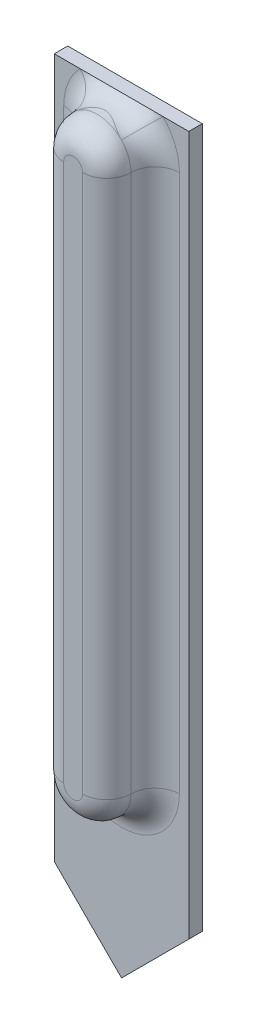
ISO-10303-21;
HEADER;
FILE_DESCRIPTION(('STEP AP214'),'2;1');
FILE_NAME('part.step','',(''),(''),'','','');
FILE_SCHEMA(('AUTOMOTIVE_DESIGN { 1 0 10303 214 1 1 1 1 }'));
ENDSEC;
DATA;
#1=APPLICATION_CONTEXT('core data for automotive mechanical design processes');
#2=APPLICATION_PROTOCOL_DEFINITION('international standard','automotive_design',2000,#1);
#3=PRODUCT_CONTEXT('',#1,'mechanical');
#4=PRODUCT('Part','Part','',(#3));
#5=PRODUCT_RELATED_PRODUCT_CATEGORY('part','',(#4));
#6=PRODUCT_DEFINITION_FORMATION('','',#4);
#7=PRODUCT_DEFINITION_CONTEXT('part definition',#1,'design');
#8=PRODUCT_DEFINITION('design','',#6,#7);
#9=PRODUCT_DEFINITION_SHAPE('','',#8);
#10=(LENGTH_UNIT() NAMED_UNIT(*) SI_UNIT(.MILLI.,.METRE.));
#11=(NAMED_UNIT(*) PLANE_ANGLE_UNIT() SI_UNIT($,.RADIAN.));
#12=(NAMED_UNIT(*) SI_UNIT($,.STERADIAN.) SOLID_ANGLE_UNIT());
#13=UNCERTAINTY_MEASURE_WITH_UNIT(LENGTH_MEASURE(1.E-05),#10,'distance_accuracy_value','');
#14=(GEOMETRIC_REPRESENTATION_CONTEXT(3) GLOBAL_UNCERTAINTY_ASSIGNED_CONTEXT((#13)) GLOBAL_UNIT_ASSIGNED_CONTEXT((#10,
#11,#12)) REPRESENTATION_CONTEXT('',''));
#15=CARTESIAN_POINT('',(0.,0.,0.));
#16=DIRECTION('',(0.,0.,1.));
#17=DIRECTION('',(1.,0.,0.));
#18=AXIS2_PLACEMENT_3D('',#15,#16,#17);
#19=CARTESIAN_POINT('',(-0.43,0.,0.28));
#20=DIRECTION('',(0.,-1.,0.));
#21=DIRECTION('',(1.,0.,0.));
#22=AXIS2_PLACEMENT_3D('',#19,#20,#21);
#23=CYLINDRICAL_SURFACE('',#22,0.28);
#24=CARTESIAN_POINT('',(-0.43,5.4,0.28));
#25=DIRECTION('',(0.,1.,0.));
#26=DIRECTION('',(1.,0.,0.));
#27=AXIS2_PLACEMENT_3D('',#24,#25,#26);
#28=CIRCLE('',#27,0.28);
#29=CARTESIAN_POINT('',(-0.15,5.4,0.28));
#30=VERTEX_POINT('',#29);
#31=CARTESIAN_POINT('',(-0.43,5.4,0.));
#32=VERTEX_POINT('',#31);
#33=EDGE_CURVE('E379',#30,#32,#28,.T.);
#34=ORIENTED_EDGE('',*,*,#33,.F.);
#35=DIRECTION('',(0.,1.,0.));
#36=VECTOR('',#35,1.);
#37=CARTESIAN_POINT('',(-0.15,0.,0.28));
#38=LINE('',#37,#36);
#39=CARTESIAN_POINT('',(-0.15,1.4,0.28));
#40=VERTEX_POINT('',#39);
#41=EDGE_CURVE('E35',#40,#30,#38,.T.);
#42=ORIENTED_EDGE('',*,*,#41,.F.);
#43=CARTESIAN_POINT('',(-0.43,1.4,0.28));
#44=DIRECTION('',(0.,-1.,0.));
#45=DIRECTION('',(1.,0.,0.));
#46=AXIS2_PLACEMENT_3D('',#43,#44,#45);
#47=CIRCLE('',#46,0.28);
#48=CARTESIAN_POINT('',(-0.43,1.4,0.));
#49=VERTEX_POINT('',#48);
#50=EDGE_CURVE('E11',#49,#40,#47,.T.);
#51=ORIENTED_EDGE('',*,*,#50,.F.);
#52=DIRECTION('',(0.,1.,0.));
#53=VECTOR('',#52,1.);
#54=CARTESIAN_POINT('',(-0.43,0.,0.));
#55=LINE('',#54,#53);
#56=EDGE_CURVE('E258',#49,#32,#55,.T.);
#57=ORIENTED_EDGE('',*,*,#56,.T.);
#58=EDGE_LOOP('',(#34,#42,#51,#57));
#59=FACE_BOUND('',#58,.T.);
#60=ADVANCED_FACE('F17',(#59),#23,.T.);
#61=CARTESIAN_POINT('',(0.,1.4,0.28));
#62=DIRECTION('',(0.,0.,1.));
#63=DIRECTION('',(1.,0.,0.));
#64=AXIS2_PLACEMENT_3D('',#61,#62,#63);
#65=TOROIDAL_SURFACE('',#64,0.43,0.28);
#66=CARTESIAN_POINT('',(0.43,1.4,0.28));
#67=DIRECTION('',(0.,1.,0.));
#68=DIRECTION('',(0.,0.,-1.));
#69=AXIS2_PLACEMENT_3D('',#66,#67,#68);
#70=CIRCLE('',#69,0.28);
#71=CARTESIAN_POINT('',(0.43,1.4,0.));
#72=VERTEX_POINT('',#71);
#73=CARTESIAN_POINT('',(0.15,1.4,0.28));
#74=VERTEX_POINT('',#73);
#75=EDGE_CURVE('E199',#72,#74,#70,.T.);
#76=ORIENTED_EDGE('',*,*,#75,.F.);
#77=CARTESIAN_POINT('',(0.,1.4,0.));
#78=DIRECTION('',(0.,0.,-1.));
#79=DIRECTION('',(1.,0.,0.));
#80=AXIS2_PLACEMENT_3D('',#77,#78,#79);
#81=CIRCLE('',#80,0.43);
#82=EDGE_CURVE('E261',#72,#49,#81,.T.);
#83=ORIENTED_EDGE('',*,*,#82,.T.);
#84=ORIENTED_EDGE('',*,*,#50,.T.);
#85=CARTESIAN_POINT('',(0.,1.4,0.28));
#86=DIRECTION('',(0.,0.,-1.));
#87=DIRECTION('',(1.,0.,0.));
#88=AXIS2_PLACEMENT_3D('',#85,#86,#87);
#89=CIRCLE('',#88,0.15);
#90=EDGE_CURVE('E210',#74,#40,#89,.T.);
#91=ORIENTED_EDGE('',*,*,#90,.F.);
#92=EDGE_LOOP('',(#76,#83,#84,#91));
#93=FACE_BOUND('',#92,.T.);
#94=ADVANCED_FACE('F212',(#93),#65,.T.);
#95=CARTESIAN_POINT('',(-0.07,5.4,0.28));
#96=DIRECTION('',(0.,1.,0.));
#97=DIRECTION('',(-1.,0.,0.));
#98=AXIS2_PLACEMENT_3D('',#95,#96,#97);
#99=CYLINDRICAL_SURFACE('',#98,0.08);
#100=DIRECTION('',(0.,-1.,0.));
#101=VECTOR('',#100,1.);
#102=CARTESIAN_POINT('',(-0.07,5.4,0.36));
#103=LINE('',#102,#101);
#104=CARTESIAN_POINT('',(-0.07,5.4,0.36));
#105=VERTEX_POINT('',#104);
#106=CARTESIAN_POINT('',(-0.07,1.4,0.36));
#107=VERTEX_POINT('',#106);
#108=EDGE_CURVE('E299',#105,#107,#103,.T.);
#109=ORIENTED_EDGE('',*,*,#108,.T.);
#110=CARTESIAN_POINT('',(-0.07,1.4,0.28));
#111=DIRECTION('',(0.,1.,0.));
#112=DIRECTION('',(-1.,0.,0.));
#113=AXIS2_PLACEMENT_3D('',#110,#111,#112);
#114=CIRCLE('',#113,0.08);
#115=EDGE_CURVE('E207',#40,#107,#114,.T.);
#116=ORIENTED_EDGE('',*,*,#115,.F.);
#117=ORIENTED_EDGE('',*,*,#41,.T.);
#118=CARTESIAN_POINT('',(-0.07,5.4,0.28));
#119=DIRECTION('',(0.,-1.,0.));
#120=DIRECTION('',(-1.,0.,0.));
#121=AXIS2_PLACEMENT_3D('',#118,#119,#120);
#122=CIRCLE('',#121,0.08);
#123=EDGE_CURVE('E215',#105,#30,#122,.T.);
#124=ORIENTED_EDGE('',*,*,#123,.F.);
#125=EDGE_LOOP('',(#109,#116,#117,#124));
#126=FACE_BOUND('',#125,.T.);
#127=ADVANCED_FACE('F937',(#126),#99,.F.);
#128=CARTESIAN_POINT('',(0.43,0.,0.28));
#129=DIRECTION('',(0.,1.,0.));
#130=DIRECTION('',(-1.,0.,0.));
#131=AXIS2_PLACEMENT_3D('',#128,#129,#130);
#132=CYLINDRICAL_SURFACE('',#131,0.28);
#133=CARTESIAN_POINT('',(0.43,5.4,0.28));
#134=DIRECTION('',(0.,1.,0.));
#135=DIRECTION('',(-1.,0.,0.));
#136=AXIS2_PLACEMENT_3D('',#133,#134,#135);
#137=CIRCLE('',#136,0.28);
#138=CARTESIAN_POINT('',(0.43,5.4,0.));
#139=VERTEX_POINT('',#138);
#140=CARTESIAN_POINT('',(0.15,5.4,0.28));
#141=VERTEX_POINT('',#140);
#142=EDGE_CURVE('E372',#139,#141,#137,.T.);
#143=ORIENTED_EDGE('',*,*,#142,.F.);
#144=DIRECTION('',(0.,-1.,0.));
#145=VECTOR('',#144,1.);
#146=CARTESIAN_POINT('',(0.43,0.,0.));
#147=LINE('',#146,#145);
#148=EDGE_CURVE('E204',#139,#72,#147,.T.);
#149=ORIENTED_EDGE('',*,*,#148,.T.);
#150=ORIENTED_EDGE('',*,*,#75,.T.);
#151=DIRECTION('',(0.,-1.,0.));
#152=VECTOR('',#151,1.);
#153=CARTESIAN_POINT('',(0.15,0.,0.28));
#154=LINE('',#153,#152);
#155=EDGE_CURVE('E202',#141,#74,#154,.T.);
#156=ORIENTED_EDGE('',*,*,#155,.F.);
#157=EDGE_LOOP('',(#143,#149,#150,#156));
#158=FACE_BOUND('',#157,.T.);
#159=ADVANCED_FACE('F200',(#158),#132,.T.);
#160=CARTESIAN_POINT('',(0.15,1.4,0.28));
#161=CARTESIAN_POINT('',(0.15,1.4,0.300943951024));
#162=CARTESIAN_POINT('',(0.143421785118,1.4,0.321886120056));
#163=CARTESIAN_POINT('',(0.130255211971,1.4,0.340255211971));
#164=CARTESIAN_POINT('',(0.111886120056,1.4,0.353421785118));
#165=CARTESIAN_POINT('',(0.09094395102393,1.4,0.36));
#166=CARTESIAN_POINT('',(0.07,1.4,0.36));
#167=(BOUNDED_CURVE() B_SPLINE_CURVE(6,(#160,#161,#162,#163,#164,#165,#166),.UNSPECIFIED.,.F.,
.F.) B_SPLINE_CURVE_WITH_KNOTS((7,7),(0.,1.570796326795),
.UNSPECIFIED.) CURVE() GEOMETRIC_REPRESENTATION_ITEM() RATIONAL_B_SPLINE_CURVE((1.,1.,1.,1.,1.,
1.,1.)) REPRESENTATION_ITEM(''));
#168=CARTESIAN_POINT('',(0.,1.4,0.28));
#169=DIRECTION('',(0.,0.,-1.));
#170=AXIS1_PLACEMENT('',#168,#169);
#171=SURFACE_OF_REVOLUTION('',#167,#170);
#172=CARTESIAN_POINT('',(0.07,1.4,0.28));
#173=DIRECTION('',(0.,-1.,0.));
#174=DIRECTION('',(0.,0.,-1.));
#175=AXIS2_PLACEMENT_3D('',#172,#173,#174);
#176=CIRCLE('',#175,0.08);
#177=CARTESIAN_POINT('',(0.07,1.4,0.36));
#178=VERTEX_POINT('',#177);
#179=EDGE_CURVE('E218',#74,#178,#176,.T.);
#180=ORIENTED_EDGE('',*,*,#179,.F.);
#181=ORIENTED_EDGE('',*,*,#90,.T.);
#182=ORIENTED_EDGE('',*,*,#115,.T.);
#183=CARTESIAN_POINT('',(0.,1.4,0.36));
#184=DIRECTION('',(0.,0.,1.));
#185=DIRECTION('',(1.,0.,0.));
#186=AXIS2_PLACEMENT_3D('',#183,#184,#185);
#187=CIRCLE('',#186,0.07);
#188=EDGE_CURVE('E221',#107,#178,#187,.T.);
#189=ORIENTED_EDGE('',*,*,#188,.T.);
#190=EDGE_LOOP('',(#180,#181,#182,#189));
#191=FACE_BOUND('',#190,.T.);
#192=ADVANCED_FACE('F219',(#191),#171,.T.);
#193=CARTESIAN_POINT('',(0.15,5.4,0.28));
#194=CARTESIAN_POINT('',(0.15,5.4,0.300943951024));
#195=CARTESIAN_POINT('',(0.143421785118,5.4,0.321886120056));
#196=CARTESIAN_POINT('',(0.130255211971,5.4,0.340255211971));
#197=CARTESIAN_POINT('',(0.111886120056,5.4,0.353421785118));
#198=CARTESIAN_POINT('',(0.09094395102393,5.4,0.36));
#199=CARTESIAN_POINT('',(0.07,5.4,0.36));
#200=(BOUNDED_CURVE() B_SPLINE_CURVE(6,(#193,#194,#195,#196,#197,#198,#199),.UNSPECIFIED.,.F.,
.F.) B_SPLINE_CURVE_WITH_KNOTS((7,7),(0.,1.570796326795),
.UNSPECIFIED.) CURVE() GEOMETRIC_REPRESENTATION_ITEM() RATIONAL_B_SPLINE_CURVE((1.,1.,1.,1.,1.,
1.,1.)) REPRESENTATION_ITEM(''));
#201=CARTESIAN_POINT('',(0.,5.4,0.28));
#202=DIRECTION('',(0.,0.,-1.));
#203=AXIS1_PLACEMENT('',#201,#202);
#204=SURFACE_OF_REVOLUTION('',#200,#203);
#205=CARTESIAN_POINT('',(0.07,5.4,0.28));
#206=DIRECTION('',(0.,1.,0.));
#207=DIRECTION('',(0.,0.,-1.));
#208=AXIS2_PLACEMENT_3D('',#205,#206,#207);
#209=CIRCLE('',#208,0.08);
#210=CARTESIAN_POINT('',(0.07,5.4,0.36));
#211=VERTEX_POINT('',#210);
#212=EDGE_CURVE('E226',#211,#141,#209,.T.);
#213=ORIENTED_EDGE('',*,*,#212,.F.);
#214=CARTESIAN_POINT('',(0.,5.4,0.36));
#215=DIRECTION('',(0.,0.,1.));
#216=DIRECTION('',(1.,0.,0.));
#217=AXIS2_PLACEMENT_3D('',#214,#215,#216);
#218=CIRCLE('',#217,0.07);
#219=EDGE_CURVE('E303',#211,#105,#218,.T.);
#220=ORIENTED_EDGE('',*,*,#219,.T.);
#221=ORIENTED_EDGE('',*,*,#123,.T.);
#222=CARTESIAN_POINT('',(0.,5.4,0.28));
#223=DIRECTION('',(0.,0.,-1.));
#224=DIRECTION('',(1.,0.,0.));
#225=AXIS2_PLACEMENT_3D('',#222,#223,#224);
#226=CIRCLE('',#225,0.15);
#227=EDGE_CURVE('E376',#30,#141,#226,.T.);
#228=ORIENTED_EDGE('',*,*,#227,.T.);
#229=EDGE_LOOP('',(#213,#220,#221,#228));
#230=FACE_BOUND('',#229,.T.);
#231=ADVANCED_FACE('F404',(#230),#204,.T.);
#232=CARTESIAN_POINT('',(0.,5.4,0.28));
#233=DIRECTION('',(0.,0.,1.));
#234=DIRECTION('',(1.,0.,0.));
#235=AXIS2_PLACEMENT_3D('',#232,#233,#234);
#236=TOROIDAL_SURFACE('',#235,0.43,0.28);
#237=ORIENTED_EDGE('',*,*,#142,.T.);
#238=ORIENTED_EDGE('',*,*,#227,.F.);
#239=ORIENTED_EDGE('',*,*,#33,.T.);
#240=CARTESIAN_POINT('',(0.,5.4,0.));
#241=DIRECTION('',(0.,0.,-1.));
#242=DIRECTION('',(1.,0.,0.));
#243=AXIS2_PLACEMENT_3D('',#240,#241,#242);
#244=CIRCLE('',#243,0.43);
#245=CARTESIAN_POINT('',(-0.380657326213184,5.6,-2.85944483641018E-13));
#246=VERTEX_POINT('',#245);
#247=EDGE_CURVE('E262',#32,#246,#244,.T.);
#248=ORIENTED_EDGE('',*,*,#247,.T.);
#249=CARTESIAN_POINT('',(0.380657326213,5.6,0.));
#250=CARTESIAN_POINT('',(0.369265778447278,5.6,-1.33592421031915E-06));
#251=CARTESIAN_POINT('',(0.357884462033694,5.6,0.000545017819219254));
#252=CARTESIAN_POINT('',(0.335235360128118,5.6,0.00265065401306003));
#253=CARTESIAN_POINT('',(0.323967407943893,5.6,0.00420812242431116));
#254=CARTESIAN_POINT('',(0.290870595400767,5.6,0.0101940780378531));
#255=CARTESIAN_POINT('',(0.269276279320048,5.6,0.0159435030557364));
#256=CARTESIAN_POINT('',(0.226436441400275,5.6,0.0303853868389739));
#257=CARTESIAN_POINT('',(0.205220137236004,5.6,0.0391598792523773));
#258=CARTESIAN_POINT('',(0.163476360737768,5.6,0.0585149386945481));
#259=CARTESIAN_POINT('',(0.142955231678801,5.6,0.0691085304697929));
#260=CARTESIAN_POINT('',(0.109404370335143,5.6,0.0861820813977293));
#261=CARTESIAN_POINT('',(0.0964063955692927,5.6,0.0927366145753031));
#262=CARTESIAN_POINT('',(0.0699170110930512,5.6,0.104712716842719));
#263=CARTESIAN_POINT('',(0.0564288225283927,5.6,0.110140508200042));
#264=CARTESIAN_POINT('',(0.0338856294843694,5.6,0.116492705298667));
#265=CARTESIAN_POINT('',(0.0251152147782352,5.6,0.118345938032509));
#266=CARTESIAN_POINT('',(0.00739313410097159,5.6,0.120388493139228));
#267=CARTESIAN_POINT('',(-0.00155784046259295,5.6,0.120583270817005));
#268=CARTESIAN_POINT('',(-0.0192952675839967,5.6,0.119261377805226));
#269=CARTESIAN_POINT('',(-0.0280820925903135,5.6,0.117749231205838));
#270=CARTESIAN_POINT('',(-0.0453551978293148,5.6,0.113456170266929));
#271=CARTESIAN_POINT('',(-0.0538399562089449,5.6,0.110669605317146));
#272=CARTESIAN_POINT('',(-0.0717306776236306,5.6,0.103880614644502));
#273=CARTESIAN_POINT('',(-0.0810894289585774,5.6,0.0997598543903345));
#274=CARTESIAN_POINT('',(-0.0996007450859248,5.6,0.0910655495473647));
#275=CARTESIAN_POINT('',(-0.108752997062347,5.6,0.0864913681161041));
#276=CARTESIAN_POINT('',(-0.132817275338334,5.6,0.0742957039799425));
#277=CARTESIAN_POINT('',(-0.147685455573006,5.6,0.0665887377592019));
#278=CARTESIAN_POINT('',(-0.177726505314637,5.6,0.0517985874107665));
#279=CARTESIAN_POINT('',(-0.19289915207552,5.6,0.0447149663116638));
#280=CARTESIAN_POINT('',(-0.223642460063189,5.6,0.0317624590156617));
#281=CARTESIAN_POINT('',(-0.239209609326278,5.6,0.0258854489598574));
#282=CARTESIAN_POINT('',(-0.270849566509956,5.6,0.0157133359664126));
#283=CARTESIAN_POINT('',(-0.286921869000176,5.6,0.0114167032459062));
#284=CARTESIAN_POINT('',(-0.315858089459119,5.6,0.00548463031003479));
#285=CARTESIAN_POINT('',(-0.328643593557601,5.6,0.00347043632575685));
#286=CARTESIAN_POINT('',(-0.354499175550265,5.6,0.000718361207376242));
#287=CARTESIAN_POINT('',(-0.36757083423336,5.6,-4.4603957010552E-06));
#288=CARTESIAN_POINT('',(-0.380657326212883,5.6,-5.71888967282037E-13));
#289=B_SPLINE_CURVE_WITH_KNOTS('',3,(#249,#250,#251,#252,#253,#254,#255,#256,#257,#258,#259,
#260,#261,#262,#263,#264,#265,#266,#267,#268,#269,#270,#271,#272,#273,#274,#275,#276,#277,#278,
#279,#280,#281,#282,#283,#284,#285,#286,#287,#288),.UNSPECIFIED.,.F.,.F.,(4,2,2,2,2,2,2,2,2,2,2,
2,2,2,2,2,2,2,2,4),(0.,0.034145005419316,0.0682289200042966,0.134997870390923,0.203742085432163,
0.27300076352762,0.316685757040761,0.360122681843135,0.386894366118891,0.413577953734025,
0.440190983979014,0.466923174453457,0.497572761076844,0.52826602284001,0.578506324787384,
0.628711122433613,0.678565934817153,0.728372360648604,0.767139947509182,0.806356748207118),.UNSPECIFIED.);
#290=CARTESIAN_POINT('',(0.380657326213243,5.6,0.));
#291=VERTEX_POINT('',#290);
#292=EDGE_CURVE('E22',#291,#246,#289,.T.);
#293=ORIENTED_EDGE('',*,*,#292,.F.);
#294=CARTESIAN_POINT('',(0.,5.4,0.));
#295=DIRECTION('',(0.,0.,-1.));
#296=DIRECTION('',(1.,0.,0.));
#297=AXIS2_PLACEMENT_3D('',#294,#295,#296);
#298=CIRCLE('',#297,0.43);
#299=EDGE_CURVE('E430',#291,#139,#298,.T.);
#300=ORIENTED_EDGE('',*,*,#299,.T.);
#301=EDGE_LOOP('',(#237,#238,#239,#248,#293,#300));
#302=FACE_BOUND('',#301,.T.);
#303=ADVANCED_FACE('F407',(#302),#236,.T.);
#304=CARTESIAN_POINT('',(0.07,5.4,0.28));
#305=DIRECTION('',(0.,-1.,0.));
#306=DIRECTION('',(1.,0.,0.));
#307=AXIS2_PLACEMENT_3D('',#304,#305,#306);
#308=CYLINDRICAL_SURFACE('',#307,0.08);
#309=ORIENTED_EDGE('',*,*,#155,.T.);
#310=ORIENTED_EDGE('',*,*,#179,.T.);
#311=DIRECTION('',(0.,1.,0.));
#312=VECTOR('',#311,1.);
#313=CARTESIAN_POINT('',(0.07,5.4,0.36));
#314=LINE('',#313,#312);
#315=EDGE_CURVE('E236',#178,#211,#314,.T.);
#316=ORIENTED_EDGE('',*,*,#315,.T.);
#317=ORIENTED_EDGE('',*,*,#212,.T.);
#318=EDGE_LOOP('',(#309,#310,#316,#317));
#319=FACE_BOUND('',#318,.T.);
#320=ADVANCED_FACE('F229',(#319),#308,.F.);
#321=CARTESIAN_POINT('',(0.,5.4,0.36));
#322=DIRECTION('',(0.,0.,1.));
#323=DIRECTION('',(1.,0.,0.));
#324=AXIS2_PLACEMENT_3D('',#321,#322,#323);
#325=PLANE('',#324);
#326=ORIENTED_EDGE('',*,*,#108,.F.);
#327=ORIENTED_EDGE('',*,*,#219,.F.);
#328=ORIENTED_EDGE('',*,*,#315,.F.);
#329=ORIENTED_EDGE('',*,*,#188,.F.);
#330=EDGE_LOOP('',(#326,#327,#328,#329));
#331=FACE_BOUND('',#330,.T.);
#332=ADVANCED_FACE('F898',(#331),#325,.F.);
#333=CARTESIAN_POINT('',(0.,5.6,0.1));
#334=DIRECTION('',(0.,-1.,0.));
#335=DIRECTION('',(0.,0.,-1.));
#336=AXIS2_PLACEMENT_3D('',#333,#334,#335);
#337=PLANE('',#336);
#338=ORIENTED_EDGE('',*,*,#292,.T.);
#339=DIRECTION('',(-1.,0.,0.));
#340=VECTOR('',#339,1.);
#341=CARTESIAN_POINT('',(0.,5.6,0.));
#342=LINE('',#341,#340);
#343=EDGE_CURVE('E423',#291,#246,#342,.T.);
#344=ORIENTED_EDGE('',*,*,#343,.F.);
#345=EDGE_LOOP('',(#338,#344));
#346=FACE_BOUND('',#345,.T.);
#347=ADVANCED_FACE('F890',(#346),#337,.T.);
#348=CARTESIAN_POINT('',(-0.43,0.,0.28));
#349=DIRECTION('',(0.,-1.,0.));
#350=DIRECTION('',(1.,0.,0.));
#351=AXIS2_PLACEMENT_3D('',#348,#349,#350);
#352=CYLINDRICAL_SURFACE('',#351,0.18);
#353=CARTESIAN_POINT('',(-0.43,5.4,0.28));
#354=DIRECTION('',(0.,1.,0.));
#355=DIRECTION('',(0.,0.,1.));
#356=AXIS2_PLACEMENT_3D('',#353,#354,#355);
#357=CIRCLE('',#356,0.18);
#358=CARTESIAN_POINT('',(-0.25,5.4,0.28));
#359=VERTEX_POINT('',#358);
#360=CARTESIAN_POINT('',(-0.43,5.4,0.1));
#361=VERTEX_POINT('',#360);
#362=EDGE_CURVE('E364',#359,#361,#357,.T.);
#363=ORIENTED_EDGE('',*,*,#362,.T.);
#364=DIRECTION('',(0.,1.,0.));
#365=VECTOR('',#364,1.);
#366=CARTESIAN_POINT('',(-0.43,0.,0.1));
#367=LINE('',#366,#365);
#368=CARTESIAN_POINT('',(-0.43,1.4,0.1));
#369=VERTEX_POINT('',#368);
#370=EDGE_CURVE('E311',#369,#361,#367,.T.);
#371=ORIENTED_EDGE('',*,*,#370,.F.);
#372=CARTESIAN_POINT('',(-0.43,1.4,0.28));
#373=DIRECTION('',(0.,-1.,0.));
#374=DIRECTION('',(0.,0.,-1.));
#375=AXIS2_PLACEMENT_3D('',#372,#373,#374);
#376=CIRCLE('',#375,0.18);
#377=CARTESIAN_POINT('',(-0.25,1.4,0.28));
#378=VERTEX_POINT('',#377);
#379=EDGE_CURVE('E248',#369,#378,#376,.T.);
#380=ORIENTED_EDGE('',*,*,#379,.T.);
#381=DIRECTION('',(0.,1.,0.));
#382=VECTOR('',#381,1.);
#383=CARTESIAN_POINT('',(-0.25,5.4,0.28));
#384=LINE('',#383,#382);
#385=EDGE_CURVE('E251',#378,#359,#384,.T.);
#386=ORIENTED_EDGE('',*,*,#385,.T.);
#387=EDGE_LOOP('',(#363,#371,#380,#386));
#388=FACE_BOUND('',#387,.T.);
#389=ADVANCED_FACE('F592',(#388),#352,.F.);
#390=CARTESIAN_POINT('',(0.,1.4,0.28));
#391=DIRECTION('',(0.,0.,1.));
#392=DIRECTION('',(1.,0.,0.));
#393=AXIS2_PLACEMENT_3D('',#390,#391,#392);
#394=TOROIDAL_SURFACE('',#393,0.43,0.18);
#395=CARTESIAN_POINT('',(0.43,1.4,0.28));
#396=DIRECTION('',(0.,1.,0.));
#397=DIRECTION('',(0.,0.,1.));
#398=AXIS2_PLACEMENT_3D('',#395,#396,#397);
#399=CIRCLE('',#398,0.18);
#400=CARTESIAN_POINT('',(0.43,1.4,0.1));
#401=VERTEX_POINT('',#400);
#402=CARTESIAN_POINT('',(0.25,1.4,0.28));
#403=VERTEX_POINT('',#402);
#404=EDGE_CURVE('E360',#401,#403,#399,.T.);
#405=ORIENTED_EDGE('',*,*,#404,.T.);
#406=CARTESIAN_POINT('',(0.,1.4,0.28));
#407=DIRECTION('',(0.,0.,-1.));
#408=DIRECTION('',(1.,0.,0.));
#409=AXIS2_PLACEMENT_3D('',#406,#407,#408);
#410=CIRCLE('',#409,0.25);
#411=EDGE_CURVE('E272',#403,#378,#410,.T.);
#412=ORIENTED_EDGE('',*,*,#411,.T.);
#413=ORIENTED_EDGE('',*,*,#379,.F.);
#414=CARTESIAN_POINT('',(0.,1.4,0.1));
#415=DIRECTION('',(0.,0.,-1.));
#416=DIRECTION('',(1.,0.,0.));
#417=AXIS2_PLACEMENT_3D('',#414,#415,#416);
#418=CIRCLE('',#417,0.43);
#419=EDGE_CURVE('E321',#401,#369,#418,.T.);
#420=ORIENTED_EDGE('',*,*,#419,.F.);
#421=EDGE_LOOP('',(#405,#412,#413,#420));
#422=FACE_BOUND('',#421,.T.);
#423=ADVANCED_FACE('F866',(#422),#394,.F.);
#424=CARTESIAN_POINT('',(-0.07,5.4,0.28));
#425=DIRECTION('',(0.,1.,0.));
#426=DIRECTION('',(-1.,0.,0.));
#427=AXIS2_PLACEMENT_3D('',#424,#425,#426);
#428=CYLINDRICAL_SURFACE('',#427,0.18);
#429=DIRECTION('',(0.,-1.,0.));
#430=VECTOR('',#429,1.);
#431=CARTESIAN_POINT('',(-0.07,1.4,0.46));
#432=LINE('',#431,#430);
#433=CARTESIAN_POINT('',(-0.07,5.4,0.46));
#434=VERTEX_POINT('',#433);
#435=CARTESIAN_POINT('',(-0.07,1.4,0.46));
#436=VERTEX_POINT('',#435);
#437=EDGE_CURVE('E326',#434,#436,#432,.T.);
#438=ORIENTED_EDGE('',*,*,#437,.F.);
#439=CARTESIAN_POINT('',(-0.07,5.4,0.28));
#440=DIRECTION('',(0.,-1.,0.));
#441=DIRECTION('',(0.,0.,-1.));
#442=AXIS2_PLACEMENT_3D('',#439,#440,#441);
#443=CIRCLE('',#442,0.18);
#444=EDGE_CURVE('E273',#434,#359,#443,.T.);
#445=ORIENTED_EDGE('',*,*,#444,.T.);
#446=ORIENTED_EDGE('',*,*,#385,.F.);
#447=CARTESIAN_POINT('',(-0.07,1.4,0.28));
#448=DIRECTION('',(0.,1.,0.));
#449=DIRECTION('',(0.,0.,1.));
#450=AXIS2_PLACEMENT_3D('',#447,#448,#449);
#451=CIRCLE('',#450,0.18);
#452=EDGE_CURVE('E269',#378,#436,#451,.T.);
#453=ORIENTED_EDGE('',*,*,#452,.T.);
#454=EDGE_LOOP('',(#438,#445,#446,#453));
#455=FACE_BOUND('',#454,.T.);
#456=ADVANCED_FACE('F595',(#455),#428,.T.);
#457=CARTESIAN_POINT('',(0.,5.4,0.28));
#458=DIRECTION('',(0.,0.,1.));
#459=DIRECTION('',(1.,0.,0.));
#460=AXIS2_PLACEMENT_3D('',#457,#458,#459);
#461=TOROIDAL_SURFACE('',#460,0.43,0.18);
#462=CARTESIAN_POINT('',(-0.308058436015,5.7,0.28));
#463=DIRECTION('',(0.697674418604688,0.716414967476679,0.));
#464=DIRECTION('',(-0.716414967476679,0.697674418604688,0.));
#465=AXIS2_PLACEMENT_3D('',#462,#463,#464);
#466=CIRCLE('',#465,0.18);
#467=CARTESIAN_POINT('',(-0.179103741869,5.574418604651,0.28));
#468=VERTEX_POINT('',#467);
#469=CARTESIAN_POINT('',(-0.308058436015,5.7,0.1));
#470=VERTEX_POINT('',#469);
#471=EDGE_CURVE('E495',#468,#470,#466,.T.);
#472=ORIENTED_EDGE('',*,*,#471,.T.);
#473=CARTESIAN_POINT('',(0.,5.4,0.1));
#474=DIRECTION('',(0.,0.,-1.));
#475=DIRECTION('',(1.,0.,0.));
#476=AXIS2_PLACEMENT_3D('',#473,#474,#475);
#477=CIRCLE('',#476,0.43);
#478=EDGE_CURVE('E279',#361,#470,#477,.T.);
#479=ORIENTED_EDGE('',*,*,#478,.F.);
#480=ORIENTED_EDGE('',*,*,#362,.F.);
#481=CARTESIAN_POINT('',(0.,5.4,0.28));
#482=DIRECTION('',(0.,0.,-1.));
#483=DIRECTION('',(1.,0.,0.));
#484=AXIS2_PLACEMENT_3D('',#481,#482,#483);
#485=CIRCLE('',#484,0.25);
#486=EDGE_CURVE('E356',#359,#468,#485,.T.);
#487=ORIENTED_EDGE('',*,*,#486,.T.);
#488=EDGE_LOOP('',(#472,#479,#480,#487));
#489=FACE_BOUND('',#488,.T.);
#490=ADVANCED_FACE('F477',(#489),#461,.F.);
#491=CARTESIAN_POINT('',(0.43,0.,0.28));
#492=DIRECTION('',(0.,1.,0.));
#493=DIRECTION('',(-1.,0.,0.));
#494=AXIS2_PLACEMENT_3D('',#491,#492,#493);
#495=CYLINDRICAL_SURFACE('',#494,0.18);
#496=CARTESIAN_POINT('',(0.43,5.4,0.28));
#497=DIRECTION('',(0.,1.,0.));
#498=DIRECTION('',(0.,0.,1.));
#499=AXIS2_PLACEMENT_3D('',#496,#497,#498);
#500=CIRCLE('',#499,0.18);
#501=CARTESIAN_POINT('',(0.43,5.4,0.1));
#502=VERTEX_POINT('',#501);
#503=CARTESIAN_POINT('',(0.25,5.4,0.28));
#504=VERTEX_POINT('',#503);
#505=EDGE_CURVE('E242',#502,#504,#500,.T.);
#506=ORIENTED_EDGE('',*,*,#505,.T.);
#507=DIRECTION('',(0.,-1.,0.));
#508=VECTOR('',#507,1.);
#509=CARTESIAN_POINT('',(0.25,1.4,0.28));
#510=LINE('',#509,#508);
#511=EDGE_CURVE('E340',#504,#403,#510,.T.);
#512=ORIENTED_EDGE('',*,*,#511,.T.);
#513=ORIENTED_EDGE('',*,*,#404,.F.);
#514=DIRECTION('',(0.,-1.,0.));
#515=VECTOR('',#514,1.);
#516=CARTESIAN_POINT('',(0.43,0.,0.1));
#517=LINE('',#516,#515);
#518=EDGE_CURVE('E278',#502,#401,#517,.T.);
#519=ORIENTED_EDGE('',*,*,#518,.F.);
#520=EDGE_LOOP('',(#506,#512,#513,#519));
#521=FACE_BOUND('',#520,.T.);
#522=ADVANCED_FACE('F411',(#521),#495,.F.);
#523=CARTESIAN_POINT('',(0.25,1.4,0.28));
#524=CARTESIAN_POINT('',(0.25,1.4,0.327123889804));
#525=CARTESIAN_POINT('',(0.235199016516,1.4,0.374243770127));
#526=CARTESIAN_POINT('',(0.205574226935,1.4,0.415574226935));
#527=CARTESIAN_POINT('',(0.164243770127,1.4,0.445199016516));
#528=CARTESIAN_POINT('',(0.117123889804,1.4,0.46));
#529=CARTESIAN_POINT('',(0.07,1.4,0.46));
#530=(BOUNDED_CURVE() B_SPLINE_CURVE(6,(#523,#524,#525,#526,#527,#528,#529),.UNSPECIFIED.,.F.,
.F.) B_SPLINE_CURVE_WITH_KNOTS((7,7),(0.,1.570796326795),
.UNSPECIFIED.) CURVE() GEOMETRIC_REPRESENTATION_ITEM() RATIONAL_B_SPLINE_CURVE((1.,1.,1.,1.,1.,
1.,1.)) REPRESENTATION_ITEM(''));
#531=CARTESIAN_POINT('',(0.,1.4,0.28));
#532=DIRECTION('',(0.,0.,-1.));
#533=AXIS1_PLACEMENT('',#531,#532);
#534=SURFACE_OF_REVOLUTION('',#530,#533);
#535=CARTESIAN_POINT('',(0.07,1.4,0.28));
#536=DIRECTION('',(0.,-1.,0.));
#537=DIRECTION('',(0.,0.,-1.));
#538=AXIS2_PLACEMENT_3D('',#535,#536,#537);
#539=CIRCLE('',#538,0.18);
#540=CARTESIAN_POINT('',(0.07,1.4,0.46));
#541=VERTEX_POINT('',#540);
#542=EDGE_CURVE('E247',#403,#541,#539,.T.);
#543=ORIENTED_EDGE('',*,*,#542,.T.);
#544=CARTESIAN_POINT('',(0.,1.4,0.46));
#545=DIRECTION('',(0.,0.,1.));
#546=DIRECTION('',(1.,0.,0.));
#547=AXIS2_PLACEMENT_3D('',#544,#545,#546);
#548=CIRCLE('',#547,0.07);
#549=EDGE_CURVE('E330',#436,#541,#548,.T.);
#550=ORIENTED_EDGE('',*,*,#549,.F.);
#551=ORIENTED_EDGE('',*,*,#452,.F.);
#552=ORIENTED_EDGE('',*,*,#411,.F.);
#553=EDGE_LOOP('',(#543,#550,#551,#552));
#554=FACE_BOUND('',#553,.T.);
#555=ADVANCED_FACE('F409',(#554),#534,.F.);
#556=CARTESIAN_POINT('',(0.25,5.4,0.28));
#557=CARTESIAN_POINT('',(0.25,5.4,0.327123889804));
#558=CARTESIAN_POINT('',(0.235199016516,5.4,0.374243770127));
#559=CARTESIAN_POINT('',(0.205574226935,5.4,0.415574226935));
#560=CARTESIAN_POINT('',(0.164243770127,5.4,0.445199016516));
#561=CARTESIAN_POINT('',(0.117123889804,5.4,0.46));
#562=CARTESIAN_POINT('',(0.07,5.4,0.46));
#563=(BOUNDED_CURVE() B_SPLINE_CURVE(6,(#556,#557,#558,#559,#560,#561,#562),.UNSPECIFIED.,.F.,
.F.) B_SPLINE_CURVE_WITH_KNOTS((7,7),(0.,1.570796326795),
.UNSPECIFIED.) CURVE() GEOMETRIC_REPRESENTATION_ITEM() RATIONAL_B_SPLINE_CURVE((1.,1.,1.,1.,1.,
1.,1.)) REPRESENTATION_ITEM(''));
#564=CARTESIAN_POINT('',(0.,5.4,0.28));
#565=DIRECTION('',(0.,0.,-1.));
#566=AXIS1_PLACEMENT('',#564,#565);
#567=SURFACE_OF_REVOLUTION('',#563,#566);
#568=CARTESIAN_POINT('',(0.,5.4,0.28));
#569=DIRECTION('',(0.,0.,1.));
#570=DIRECTION('',(1.,0.,0.));
#571=AXIS2_PLACEMENT_3D('',#568,#569,#570);
#572=CIRCLE('',#571,0.25);
#573=CARTESIAN_POINT('',(0.179103741869,5.574418604651,0.28));
#574=VERTEX_POINT('',#573);
#575=EDGE_CURVE('E487',#504,#574,#572,.T.);
#576=ORIENTED_EDGE('',*,*,#575,.T.);
#577=CARTESIAN_POINT('',(0.,5.4,0.28));
#578=DIRECTION('',(0.,0.,-1.));
#579=DIRECTION('',(1.,0.,0.));
#580=AXIS2_PLACEMENT_3D('',#577,#578,#579);
#581=CIRCLE('',#580,0.25);
#582=EDGE_CURVE('E325',#468,#574,#581,.T.);
#583=ORIENTED_EDGE('',*,*,#582,.F.);
#584=ORIENTED_EDGE('',*,*,#486,.F.);
#585=ORIENTED_EDGE('',*,*,#444,.F.);
#586=CARTESIAN_POINT('',(0.,5.4,0.46));
#587=DIRECTION('',(0.,0.,1.));
#588=DIRECTION('',(1.,0.,0.));
#589=AXIS2_PLACEMENT_3D('',#586,#587,#588);
#590=CIRCLE('',#589,0.07);
#591=CARTESIAN_POINT('',(0.07,5.4,0.46));
#592=VERTEX_POINT('',#591);
#593=EDGE_CURVE('E344',#592,#434,#590,.T.);
#594=ORIENTED_EDGE('',*,*,#593,.F.);
#595=CARTESIAN_POINT('',(0.07,5.4,0.28));
#596=DIRECTION('',(0.,1.,0.));
#597=DIRECTION('',(0.,0.,1.));
#598=AXIS2_PLACEMENT_3D('',#595,#596,#597);
#599=CIRCLE('',#598,0.18);
#600=EDGE_CURVE('E336',#592,#504,#599,.T.);
#601=ORIENTED_EDGE('',*,*,#600,.T.);
#602=EDGE_LOOP('',(#576,#583,#584,#585,#594,#601));
#603=FACE_BOUND('',#602,.T.);
#604=ADVANCED_FACE('F19',(#603),#567,.F.);
#605=CARTESIAN_POINT('',(0.179103741869,5.574418604651,0.28));
#606=CARTESIAN_POINT('',(0.179103741869,5.574418604651,0.1));
#607=CARTESIAN_POINT('',(0.308058436015,5.7,0.1));
#608=CARTESIAN_POINT('',(0.155388089069,5.598771294354,0.279999554675));
#609=CARTESIAN_POINT('',(0.17641374698,5.577182078114,0.128281540501));
#610=CARTESIAN_POINT('',(0.267271783992,5.7,0.1));
#611=CARTESIAN_POINT('',(0.127321400701,5.617615548746,0.265975405936));
#612=CARTESIAN_POINT('',(0.154791727221,5.60229152599,0.144999845657));
#613=CARTESIAN_POINT('',(0.218992810852,5.7,0.1));
#614=CARTESIAN_POINT('',(0.06712662854702,5.643025270029,0.238359706539));
#615=CARTESIAN_POINT('',(0.08890005347105,5.637230452376,0.154912521513));
#616=CARTESIAN_POINT('',(0.115457799454,5.7,0.1));
#617=CARTESIAN_POINT('',(0.03402884614701,5.650006298353,0.224487723069));
#618=CARTESIAN_POINT('',(0.04430228466626,5.650010066908,0.152207807842));
#619=CARTESIAN_POINT('',(0.05852961537971,5.7,0.1));
#620=CARTESIAN_POINT('',(-0.03412132763408,5.649993693094,0.224510284252));
#621=CARTESIAN_POINT('',(-0.04442470306589,5.649989918917,0.152210706955));
#622=CARTESIAN_POINT('',(-0.05868868353747,5.7,0.1));
#623=CARTESIAN_POINT('',(-0.06712549235515,5.643019731408,0.238360025353));
#624=CARTESIAN_POINT('',(-0.0888886736979701,5.63722831075,0.154906029912));
#625=CARTESIAN_POINT('',(-0.115455846079,5.7,0.1));
#626=CARTESIAN_POINT('',(-0.127244302039,5.617654104432,0.265939195851));
#627=CARTESIAN_POINT('',(-0.154708984781,5.602344361607,0.145021284808));
#628=CARTESIAN_POINT('',(-0.21886020028,5.7,0.1));
#629=CARTESIAN_POINT('',(-0.155346806168,5.598813686174,0.279999540222));
#630=CARTESIAN_POINT('',(-0.176408857335,5.577187107829,0.128332758835));
#631=CARTESIAN_POINT('',(-0.267206351406,5.7,0.1));
#632=CARTESIAN_POINT('',(-0.179103741869,5.574418604651,0.28));
#633=CARTESIAN_POINT('',(-0.179103741869,5.574418604651,0.1));
#634=CARTESIAN_POINT('',(-0.308058436015,5.7,0.1));
#635=(BOUNDED_SURFACE() B_SPLINE_SURFACE(3,2,((#605,#606,#607),(#608,#609,#610),(#611,#612,
#613),(#614,#615,#616),(#617,#618,#619),(#620,#621,#622),(#623,#624,#625),(#626,#627,#628),
(#629,#630,#631),(#632,#633,#634)),.UNSPECIFIED.,.F.,.F.,.F.) B_SPLINE_SURFACE_WITH_KNOTS((4,2,
2,2,4),(3,3),(0.0003085299463345,0.0004831239639098,0.000657717981485,0.0008323119990602,
0.001006906016635),(0.,1.),
.UNSPECIFIED.) GEOMETRIC_REPRESENTATION_ITEM() RATIONAL_B_SPLINE_SURFACE(((1.,0.707106781187,
1.),(1.,0.765345006798,1.),(1.,0.823519548797,1.),(1.,0.903977827565,1.),(1.,0.927981770906,1.),
(1.,0.927939654697,1.),(1.,0.903962496694,1.),(1.,0.823639429235,1.),(1.,0.765459439863,1.),(1.,
0.707106781187,1.))) REPRESENTATION_ITEM('') SURFACE());
#636=CARTESIAN_POINT('',(0.308058436015,5.7,0.28));
#637=DIRECTION('',(0.697674418604688,-0.716414967476679,0.));
#638=DIRECTION('',(0.716414967476679,0.697674418604688,0.));
#639=AXIS2_PLACEMENT_3D('',#636,#637,#638);
#640=CIRCLE('',#639,0.18);
#641=CARTESIAN_POINT('',(0.308058436015,5.7,0.1));
#642=VERTEX_POINT('',#641);
#643=EDGE_CURVE('E246',#574,#642,#640,.T.);
#644=DIRECTION('',(-1.,0.,0.));
#645=VECTOR('',#644,1.);
#646=CARTESIAN_POINT('',(0.,5.7,0.1));
#647=LINE('',#646,#645);
#648=EDGE_CURVE('E257',#642,#470,#647,.T.);
#649=CARTESIAN_POINT('',(-0.179103741869,5.574418604651,0.28));
#650=CARTESIAN_POINT('',(-0.155346806168,5.598813686174,0.279999540222));
#651=CARTESIAN_POINT('',(-0.127244302039,5.617654104432,0.265939195851));
#652=CARTESIAN_POINT('',(-0.06712549235515,5.643019731408,0.238360025353));
#653=CARTESIAN_POINT('',(-0.03412132763408,5.649993693094,0.224510284252));
#654=CARTESIAN_POINT('',(0.03402884614701,5.650006298353,0.224487723069));
#655=CARTESIAN_POINT('',(0.06712662854702,5.643025270029,0.238359706539));
#656=CARTESIAN_POINT('',(0.127321400701,5.617615548746,0.265975405936));
#657=CARTESIAN_POINT('',(0.155388089069,5.598771294354,0.279999554675));
#658=CARTESIAN_POINT('',(0.179103741869,5.574418604651,0.28));
#659=(BOUNDED_CURVE() B_SPLINE_CURVE(3,(#649,#650,#651,#652,#653,#654,#655,#656,#657,#658),
.UNSPECIFIED.,.F.,.F.) B_SPLINE_CURVE_WITH_KNOTS((4,2,2,2,4),(0.0003085299463345,
0.0004831239639093,0.0006577179814845,0.0008323119990597,0.001006906016635),
.UNSPECIFIED.) CURVE() GEOMETRIC_REPRESENTATION_ITEM() RATIONAL_B_SPLINE_CURVE((1.,1.,1.,1.,1.,
1.,1.,1.,1.,1.)) REPRESENTATION_ITEM(''));
#660=EDGE_CURVE('E331',#574,#468,#659,.F.);
#661=ORIENTED_EDGE('',*,*,#643,.T.);
#662=ORIENTED_EDGE('',*,*,#648,.T.);
#663=ORIENTED_EDGE('',*,*,#471,.F.);
#664=ORIENTED_EDGE('',*,*,#660,.F.);
#665=EDGE_LOOP('',(#661,#662,#663,#664));
#666=FACE_BOUND('',#665,.T.);
#667=ADVANCED_FACE('F469',(#666),#635,.F.);
#668=CARTESIAN_POINT('',(0.,5.4,0.28));
#669=DIRECTION('',(0.,0.,1.));
#670=DIRECTION('',(1.,0.,0.));
#671=AXIS2_PLACEMENT_3D('',#668,#669,#670);
#672=TOROIDAL_SURFACE('',#671,0.43,0.18);
#673=ORIENTED_EDGE('',*,*,#505,.F.);
#674=CARTESIAN_POINT('',(0.,5.4,0.1));
#675=DIRECTION('',(0.,0.,-1.));
#676=DIRECTION('',(1.,0.,0.));
#677=AXIS2_PLACEMENT_3D('',#674,#675,#676);
#678=CIRCLE('',#677,0.43);
#679=EDGE_CURVE('E274',#642,#502,#678,.T.);
#680=ORIENTED_EDGE('',*,*,#679,.F.);
#681=ORIENTED_EDGE('',*,*,#643,.F.);
#682=ORIENTED_EDGE('',*,*,#575,.F.);
#683=EDGE_LOOP('',(#673,#680,#681,#682));
#684=FACE_BOUND('',#683,.T.);
#685=ADVANCED_FACE('F465',(#684),#672,.F.);
#686=CARTESIAN_POINT('',(0.07,5.4,0.28));
#687=DIRECTION('',(0.,-1.,0.));
#688=DIRECTION('',(1.,0.,0.));
#689=AXIS2_PLACEMENT_3D('',#686,#687,#688);
#690=CYLINDRICAL_SURFACE('',#689,0.18);
#691=ORIENTED_EDGE('',*,*,#511,.F.);
#692=ORIENTED_EDGE('',*,*,#600,.F.);
#693=DIRECTION('',(0.,1.,0.));
#694=VECTOR('',#693,1.);
#695=CARTESIAN_POINT('',(0.07,5.4,0.46));
#696=LINE('',#695,#694);
#697=EDGE_CURVE('E335',#541,#592,#696,.T.);
#698=ORIENTED_EDGE('',*,*,#697,.F.);
#699=ORIENTED_EDGE('',*,*,#542,.F.);
#700=EDGE_LOOP('',(#691,#692,#698,#699));
#701=FACE_BOUND('',#700,.T.);
#702=ADVANCED_FACE('F461',(#701),#690,.T.);
#703=CARTESIAN_POINT('',(0.,5.4,0.46));
#704=DIRECTION('',(0.,0.,1.));
#705=DIRECTION('',(1.,0.,0.));
#706=AXIS2_PLACEMENT_3D('',#703,#704,#705);
#707=PLANE('',#706);
#708=ORIENTED_EDGE('',*,*,#437,.T.);
#709=ORIENTED_EDGE('',*,*,#549,.T.);
#710=ORIENTED_EDGE('',*,*,#697,.T.);
#711=ORIENTED_EDGE('',*,*,#593,.T.);
#712=EDGE_LOOP('',(#708,#709,#710,#711));
#713=FACE_BOUND('',#712,.T.);
#714=ADVANCED_FACE('F457',(#713),#707,.T.);
#715=CARTESIAN_POINT('',(0.,5.4,0.46));
#716=DIRECTION('',(0.,0.,-1.));
#717=DIRECTION('',(-1.,0.,0.));
#718=AXIS2_PLACEMENT_3D('',#715,#716,#717);
#719=CYLINDRICAL_SURFACE('',#718,0.25);
#720=ORIENTED_EDGE('',*,*,#582,.T.);
#721=ORIENTED_EDGE('',*,*,#660,.T.);
#722=EDGE_LOOP('',(#720,#721));
#723=FACE_BOUND('',#722,.T.);
#724=ADVANCED_FACE('F446',(#723),#719,.T.);
#725=CARTESIAN_POINT('',(0.,0.,0.1));
#726=DIRECTION('',(0.,0.,1.));
#727=DIRECTION('',(1.,0.,0.));
#728=AXIS2_PLACEMENT_3D('',#725,#726,#727);
#729=PLANE('',#728);
#730=ORIENTED_EDGE('',*,*,#370,.T.);
#731=ORIENTED_EDGE('',*,*,#478,.T.);
#732=DIRECTION('',(-1.,0.,0.));
#733=VECTOR('',#732,1.);
#734=CARTESIAN_POINT('',(0.,5.7,0.1));
#735=LINE('',#734,#733);
#736=CARTESIAN_POINT('',(-0.5,5.7,0.1));
#737=VERTEX_POINT('',#736);
#738=EDGE_CURVE('E265',#470,#737,#735,.T.);
#739=ORIENTED_EDGE('',*,*,#738,.T.);
#740=DIRECTION('',(0.,-1.,0.));
#741=VECTOR('',#740,1.);
#742=CARTESIAN_POINT('',(-0.5,0.,0.1));
#743=LINE('',#742,#741);
#744=CARTESIAN_POINT('',(-0.5,0.5,0.1));
#745=VERTEX_POINT('',#744);
#746=EDGE_CURVE('E286',#737,#745,#743,.T.);
#747=ORIENTED_EDGE('',*,*,#746,.T.);
#748=DIRECTION('',(0.707106781186548,-0.707106781186548,0.));
#749=VECTOR('',#748,1.);
#750=CARTESIAN_POINT('',(0.,0.,0.1));
#751=LINE('',#750,#749);
#752=CARTESIAN_POINT('',(0.,0.,0.1));
#753=VERTEX_POINT('',#752);
#754=EDGE_CURVE('E294',#745,#753,#751,.T.);
#755=ORIENTED_EDGE('',*,*,#754,.T.);
#756=DIRECTION('',(0.707106781186548,0.707106781186548,0.));
#757=VECTOR('',#756,1.);
#758=CARTESIAN_POINT('',(0.,0.,0.1));
#759=LINE('',#758,#757);
#760=CARTESIAN_POINT('',(0.5,0.5,0.1));
#761=VERTEX_POINT('',#760);
#762=EDGE_CURVE('E307',#753,#761,#759,.T.);
#763=ORIENTED_EDGE('',*,*,#762,.T.);
#764=DIRECTION('',(0.,1.,0.));
#765=VECTOR('',#764,1.);
#766=CARTESIAN_POINT('',(0.5,0.,0.1));
#767=LINE('',#766,#765);
#768=CARTESIAN_POINT('',(0.5,5.7,0.1));
#769=VERTEX_POINT('',#768);
#770=EDGE_CURVE('E308',#761,#769,#767,.T.);
#771=ORIENTED_EDGE('',*,*,#770,.T.);
#772=DIRECTION('',(-1.,0.,0.));
#773=VECTOR('',#772,1.);
#774=CARTESIAN_POINT('',(0.,5.7,0.1));
#775=LINE('',#774,#773);
#776=EDGE_CURVE('E252',#769,#642,#775,.T.);
#777=ORIENTED_EDGE('',*,*,#776,.T.);
#778=ORIENTED_EDGE('',*,*,#679,.T.);
#779=ORIENTED_EDGE('',*,*,#518,.T.);
#780=ORIENTED_EDGE('',*,*,#419,.T.);
#781=EDGE_LOOP('',(#730,#731,#739,#747,#755,#763,#771,#777,#778,#779,#780));
#782=FACE_BOUND('',#781,.T.);
#783=ADVANCED_FACE('F456',(#782),#729,.T.);
#784=CARTESIAN_POINT('',(0.5,0.,0.1));
#785=DIRECTION('',(-1.,0.,0.));
#786=DIRECTION('',(0.,0.,1.));
#787=AXIS2_PLACEMENT_3D('',#784,#785,#786);
#788=PLANE('',#787);
#789=DIRECTION('',(0.,1.,0.));
#790=VECTOR('',#789,1.);
#791=CARTESIAN_POINT('',(0.5,0.,0.));
#792=LINE('',#791,#790);
#793=CARTESIAN_POINT('',(0.5,0.5,0.));
#794=VERTEX_POINT('',#793);
#795=CARTESIAN_POINT('',(0.5,5.7,0.));
#796=VERTEX_POINT('',#795);
#797=EDGE_CURVE('E564',#794,#796,#792,.T.);
#798=ORIENTED_EDGE('',*,*,#797,.T.);
#799=DIRECTION('',(0.,0.,-1.));
#800=VECTOR('',#799,1.);
#801=CARTESIAN_POINT('',(0.5,5.7,0.1));
#802=LINE('',#801,#800);
#803=EDGE_CURVE('E256',#769,#796,#802,.T.);
#804=ORIENTED_EDGE('',*,*,#803,.F.);
#805=ORIENTED_EDGE('',*,*,#770,.F.);
#806=DIRECTION('',(0.,0.,-1.));
#807=VECTOR('',#806,1.);
#808=CARTESIAN_POINT('',(0.5,0.5,0.1));
#809=LINE('',#808,#807);
#810=EDGE_CURVE('E298',#761,#794,#809,.T.);
#811=ORIENTED_EDGE('',*,*,#810,.T.);
#812=EDGE_LOOP('',(#798,#804,#805,#811));
#813=FACE_BOUND('',#812,.T.);
#814=ADVANCED_FACE('F579',(#813),#788,.F.);
#815=CARTESIAN_POINT('',(0.,0.,0.1));
#816=DIRECTION('',(-0.707106781186548,0.707106781186548,0.));
#817=DIRECTION('',(0.,0.,1.));
#818=AXIS2_PLACEMENT_3D('',#815,#816,#817);
#819=PLANE('',#818);
#820=DIRECTION('',(0.707106781186548,0.707106781186548,0.));
#821=VECTOR('',#820,1.);
#822=CARTESIAN_POINT('',(0.,0.,0.));
#823=LINE('',#822,#821);
#824=CARTESIAN_POINT('',(0.,0.,0.));
#825=VERTEX_POINT('',#824);
#826=EDGE_CURVE('E554',#825,#794,#823,.T.);
#827=ORIENTED_EDGE('',*,*,#826,.T.);
#828=ORIENTED_EDGE('',*,*,#810,.F.);
#829=ORIENTED_EDGE('',*,*,#762,.F.);
#830=DIRECTION('',(0.,0.,-1.));
#831=VECTOR('',#830,1.);
#832=CARTESIAN_POINT('',(0.,0.,0.1));
#833=LINE('',#832,#831);
#834=EDGE_CURVE('E290',#753,#825,#833,.T.);
#835=ORIENTED_EDGE('',*,*,#834,.T.);
#836=EDGE_LOOP('',(#827,#828,#829,#835));
#837=FACE_BOUND('',#836,.T.);
#838=ADVANCED_FACE('F576',(#837),#819,.F.);
#839=CARTESIAN_POINT('',(0.,0.,0.1));
#840=DIRECTION('',(0.707106781186548,0.707106781186548,0.));
#841=DIRECTION('',(0.,0.,-1.));
#842=AXIS2_PLACEMENT_3D('',#839,#840,#841);
#843=PLANE('',#842);
#844=DIRECTION('',(0.707106781186548,-0.707106781186548,0.));
#845=VECTOR('',#844,1.);
#846=CARTESIAN_POINT('',(0.,0.,0.));
#847=LINE('',#846,#845);
#848=CARTESIAN_POINT('',(-0.5,0.5,0.));
#849=VERTEX_POINT('',#848);
#850=EDGE_CURVE('E548',#849,#825,#847,.T.);
#851=ORIENTED_EDGE('',*,*,#850,.T.);
#852=ORIENTED_EDGE('',*,*,#834,.F.);
#853=ORIENTED_EDGE('',*,*,#754,.F.);
#854=DIRECTION('',(0.,0.,-1.));
#855=VECTOR('',#854,1.);
#856=CARTESIAN_POINT('',(-0.5,0.5,0.1));
#857=LINE('',#856,#855);
#858=EDGE_CURVE('E283',#745,#849,#857,.T.);
#859=ORIENTED_EDGE('',*,*,#858,.T.);
#860=EDGE_LOOP('',(#851,#852,#853,#859));
#861=FACE_BOUND('',#860,.T.);
#862=ADVANCED_FACE('F778',(#861),#843,.F.);
#863=CARTESIAN_POINT('',(-0.5,0.,0.1));
#864=DIRECTION('',(1.,0.,0.));
#865=DIRECTION('',(0.,1.,0.));
#866=AXIS2_PLACEMENT_3D('',#863,#864,#865);
#867=PLANE('',#866);
#868=DIRECTION('',(0.,-1.,0.));
#869=VECTOR('',#868,1.);
#870=CARTESIAN_POINT('',(-0.5,0.,0.));
#871=LINE('',#870,#869);
#872=CARTESIAN_POINT('',(-0.5,5.7,0.));
#873=VERTEX_POINT('',#872);
#874=EDGE_CURVE('E543',#873,#849,#871,.T.);
#875=ORIENTED_EDGE('',*,*,#874,.T.);
#876=ORIENTED_EDGE('',*,*,#858,.F.);
#877=ORIENTED_EDGE('',*,*,#746,.F.);
#878=DIRECTION('',(0.,0.,-1.));
#879=VECTOR('',#878,1.);
#880=CARTESIAN_POINT('',(-0.5,5.7,0.1));
#881=LINE('',#880,#879);
#882=EDGE_CURVE('E78',#737,#873,#881,.T.);
#883=ORIENTED_EDGE('',*,*,#882,.T.);
#884=EDGE_LOOP('',(#875,#876,#877,#883));
#885=FACE_BOUND('',#884,.T.);
#886=ADVANCED_FACE('F783',(#885),#867,.F.);
#887=CARTESIAN_POINT('',(0.,5.7,0.1));
#888=DIRECTION('',(0.,-1.,0.));
#889=DIRECTION('',(0.,0.,-1.));
#890=AXIS2_PLACEMENT_3D('',#887,#888,#889);
#891=PLANE('',#890);
#892=DIRECTION('',(-1.,0.,0.));
#893=VECTOR('',#892,1.);
#894=CARTESIAN_POINT('',(0.,5.7,0.));
#895=LINE('',#894,#893);
#896=EDGE_CURVE('E240',#796,#873,#895,.T.);
#897=ORIENTED_EDGE('',*,*,#896,.T.);
#898=ORIENTED_EDGE('',*,*,#882,.F.);
#899=ORIENTED_EDGE('',*,*,#738,.F.);
#900=ORIENTED_EDGE('',*,*,#648,.F.);
#901=ORIENTED_EDGE('',*,*,#776,.F.);
#902=ORIENTED_EDGE('',*,*,#803,.T.);
#903=EDGE_LOOP('',(#897,#898,#899,#900,#901,#902));
#904=FACE_BOUND('',#903,.T.);
#905=ADVANCED_FACE('F533',(#904),#891,.F.);
#906=CARTESIAN_POINT('',(0.,0.,0.));
#907=DIRECTION('',(0.,0.,1.));
#908=DIRECTION('',(1.,0.,0.));
#909=AXIS2_PLACEMENT_3D('',#906,#907,#908);
#910=PLANE('',#909);
#911=ORIENTED_EDGE('',*,*,#299,.F.);
#912=ORIENTED_EDGE('',*,*,#343,.T.);
#913=ORIENTED_EDGE('',*,*,#247,.F.);
#914=ORIENTED_EDGE('',*,*,#56,.F.);
#915=ORIENTED_EDGE('',*,*,#82,.F.);
#916=ORIENTED_EDGE('',*,*,#148,.F.);
#917=EDGE_LOOP('',(#911,#912,#913,#914,#915,#916));
#918=FACE_BOUND('',#917,.T.);
#919=ORIENTED_EDGE('',*,*,#797,.F.);
#920=ORIENTED_EDGE('',*,*,#826,.F.);
#921=ORIENTED_EDGE('',*,*,#850,.F.);
#922=ORIENTED_EDGE('',*,*,#874,.F.);
#923=ORIENTED_EDGE('',*,*,#896,.F.);
#924=EDGE_LOOP('',(#919,#920,#921,#922,#923));
#925=FACE_BOUND('',#924,.T.);
#926=ADVANCED_FACE('F545',(#918,#925),#910,.F.);
#927=CLOSED_SHELL('',(#60,#94,#127,#159,#192,#231,#303,#320,#332,#347,#389,#423,#456,#490,#522,
#555,#604,#667,#685,#702,#714,#724,#783,#814,#838,#862,#886,#905,#926));
#928=MANIFOLD_SOLID_BREP('B1',#927);
#929=ADVANCED_BREP_SHAPE_REPRESENTATION('',(#18,#928),#14);
#930=SHAPE_DEFINITION_REPRESENTATION(#9,#929);
ENDSEC;
END-ISO-10303-21;
